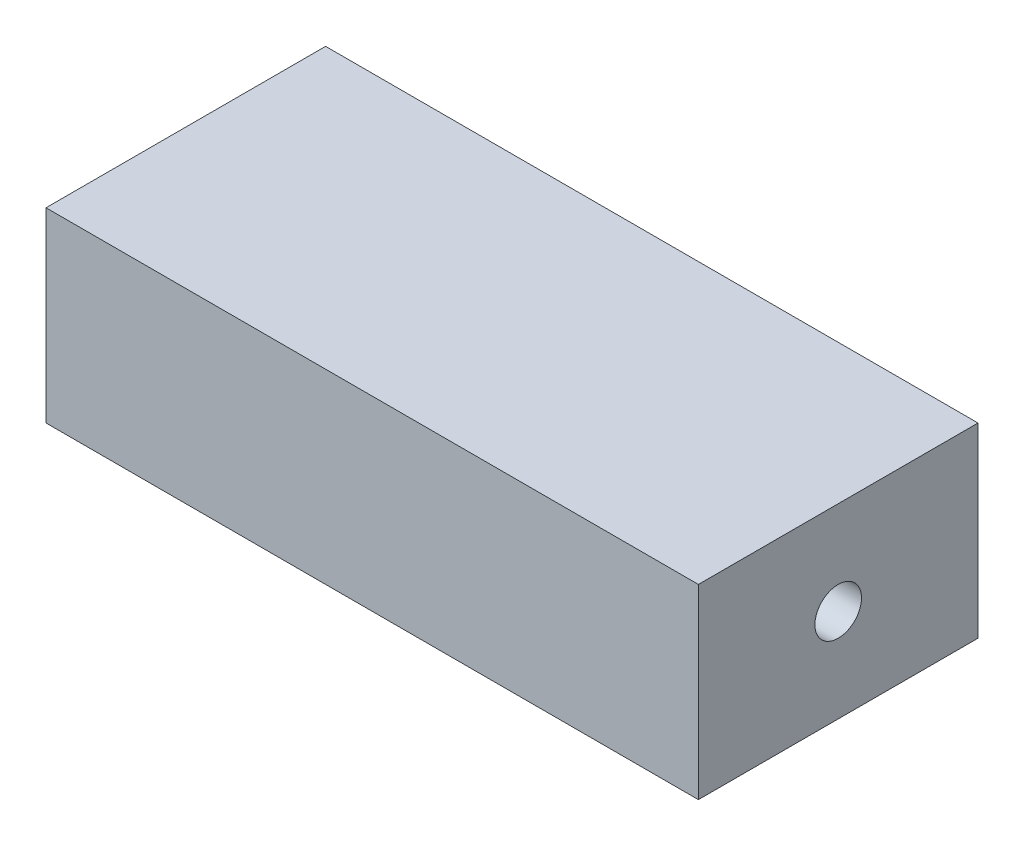
ISO-10303-21;
HEADER;
FILE_DESCRIPTION(('STEP AP214'),'2;1');
FILE_NAME('part.step','',(''),(''),'','','');
FILE_SCHEMA(('AUTOMOTIVE_DESIGN { 1 0 10303 214 1 1 1 1 }'));
ENDSEC;
DATA;
#1=APPLICATION_CONTEXT('core data for automotive mechanical design processes');
#2=APPLICATION_PROTOCOL_DEFINITION('international standard','automotive_design',2000,#1);
#3=PRODUCT_CONTEXT('',#1,'mechanical');
#4=PRODUCT('Part','Part','',(#3));
#5=PRODUCT_RELATED_PRODUCT_CATEGORY('part','',(#4));
#6=PRODUCT_DEFINITION_FORMATION('','',#4);
#7=PRODUCT_DEFINITION_CONTEXT('part definition',#1,'design');
#8=PRODUCT_DEFINITION('design','',#6,#7);
#9=PRODUCT_DEFINITION_SHAPE('','',#8);
#10=(LENGTH_UNIT() NAMED_UNIT(*) SI_UNIT(.MILLI.,.METRE.));
#11=(NAMED_UNIT(*) PLANE_ANGLE_UNIT() SI_UNIT($,.RADIAN.));
#12=(NAMED_UNIT(*) SI_UNIT($,.STERADIAN.) SOLID_ANGLE_UNIT());
#13=UNCERTAINTY_MEASURE_WITH_UNIT(LENGTH_MEASURE(1.E-05),#10,'distance_accuracy_value','');
#14=(GEOMETRIC_REPRESENTATION_CONTEXT(3) GLOBAL_UNCERTAINTY_ASSIGNED_CONTEXT((#13)) GLOBAL_UNIT_ASSIGNED_CONTEXT((#10,
#11,#12)) REPRESENTATION_CONTEXT('',''));
#15=CARTESIAN_POINT('',(0.,0.,0.));
#16=DIRECTION('',(0.,0.,1.));
#17=DIRECTION('',(1.,0.,0.));
#18=AXIS2_PLACEMENT_3D('',#15,#16,#17);
#19=CARTESIAN_POINT('',(0.,25.4,0.));
#20=DIRECTION('',(1.,0.,0.));
#21=DIRECTION('',(0.,0.,-1.));
#22=AXIS2_PLACEMENT_3D('',#19,#20,#21);
#23=PLANE('',#22);
#24=CARTESIAN_POINT('',(0.,12.7,-19.05));
#25=DIRECTION('',(1.,0.,0.));
#26=DIRECTION('',(0.,0.,-1.));
#27=AXIS2_PLACEMENT_3D('',#24,#25,#26);
#28=CIRCLE('',#27,3.175);
#29=CARTESIAN_POINT('',(0.,12.7,-22.225));
#30=VERTEX_POINT('',#29);
#31=EDGE_CURVE('E110',#30,#30,#28,.T.);
#32=ORIENTED_EDGE('',*,*,#31,.T.);
#33=EDGE_LOOP('',(#32));
#34=FACE_BOUND('',#33,.T.);
#35=DIRECTION('',(0.,0.,1.));
#36=VECTOR('',#35,1.);
#37=CARTESIAN_POINT('',(0.,0.,0.));
#38=LINE('',#37,#36);
#39=CARTESIAN_POINT('',(0.,0.,-38.1));
#40=VERTEX_POINT('',#39);
#41=CARTESIAN_POINT('',(0.,0.,0.));
#42=VERTEX_POINT('',#41);
#43=EDGE_CURVE('E106',#40,#42,#38,.T.);
#44=ORIENTED_EDGE('',*,*,#43,.T.);
#45=DIRECTION('',(0.,-1.,0.));
#46=VECTOR('',#45,1.);
#47=CARTESIAN_POINT('',(0.,25.4,0.));
#48=LINE('',#47,#46);
#49=CARTESIAN_POINT('',(0.,25.4,0.));
#50=VERTEX_POINT('',#49);
#51=EDGE_CURVE('E11',#50,#42,#48,.T.);
#52=ORIENTED_EDGE('',*,*,#51,.F.);
#53=DIRECTION('',(0.,0.,1.));
#54=VECTOR('',#53,1.);
#55=CARTESIAN_POINT('',(0.,25.4,0.));
#56=LINE('',#55,#54);
#57=CARTESIAN_POINT('',(0.,25.4,-38.1));
#58=VERTEX_POINT('',#57);
#59=EDGE_CURVE('E90',#58,#50,#56,.T.);
#60=ORIENTED_EDGE('',*,*,#59,.F.);
#61=DIRECTION('',(0.,-1.,0.));
#62=VECTOR('',#61,1.);
#63=CARTESIAN_POINT('',(0.,25.4,-38.1));
#64=LINE('',#63,#62);
#65=EDGE_CURVE('E102',#58,#40,#64,.T.);
#66=ORIENTED_EDGE('',*,*,#65,.T.);
#67=EDGE_LOOP('',(#44,#52,#60,#66));
#68=FACE_BOUND('',#67,.T.);
#69=ADVANCED_FACE('F38',(#34,#68),#23,.F.);
#70=CARTESIAN_POINT('',(0.,25.4,0.));
#71=DIRECTION('',(0.,0.,-1.));
#72=DIRECTION('',(-1.,0.,0.));
#73=AXIS2_PLACEMENT_3D('',#70,#71,#72);
#74=PLANE('',#73);
#75=DIRECTION('',(1.,0.,0.));
#76=VECTOR('',#75,1.);
#77=CARTESIAN_POINT('',(0.,0.,0.));
#78=LINE('',#77,#76);
#79=CARTESIAN_POINT('',(88.9,0.,0.));
#80=VERTEX_POINT('',#79);
#81=EDGE_CURVE('E95',#42,#80,#78,.T.);
#82=ORIENTED_EDGE('',*,*,#81,.T.);
#83=DIRECTION('',(0.,-1.,0.));
#84=VECTOR('',#83,1.);
#85=CARTESIAN_POINT('',(88.9,25.4,0.));
#86=LINE('',#85,#84);
#87=CARTESIAN_POINT('',(88.9,25.4,0.));
#88=VERTEX_POINT('',#87);
#89=EDGE_CURVE('E47',#88,#80,#86,.T.);
#90=ORIENTED_EDGE('',*,*,#89,.F.);
#91=DIRECTION('',(1.,0.,0.));
#92=VECTOR('',#91,1.);
#93=CARTESIAN_POINT('',(0.,25.4,0.));
#94=LINE('',#93,#92);
#95=EDGE_CURVE('E85',#50,#88,#94,.T.);
#96=ORIENTED_EDGE('',*,*,#95,.F.);
#97=ORIENTED_EDGE('',*,*,#51,.T.);
#98=EDGE_LOOP('',(#82,#90,#96,#97));
#99=FACE_BOUND('',#98,.T.);
#100=ADVANCED_FACE('F94',(#99),#74,.F.);
#101=CARTESIAN_POINT('',(88.9,25.4,0.));
#102=DIRECTION('',(-1.,0.,0.));
#103=DIRECTION('',(0.,0.,1.));
#104=AXIS2_PLACEMENT_3D('',#101,#102,#103);
#105=PLANE('',#104);
#106=CARTESIAN_POINT('',(88.9,12.7,-19.05));
#107=DIRECTION('',(1.,0.,0.));
#108=DIRECTION('',(0.,0.,-1.));
#109=AXIS2_PLACEMENT_3D('',#106,#107,#108);
#110=CIRCLE('',#109,3.175);
#111=CARTESIAN_POINT('',(88.9,12.7,-22.225));
#112=VERTEX_POINT('',#111);
#113=EDGE_CURVE('E127',#112,#112,#110,.T.);
#114=ORIENTED_EDGE('',*,*,#113,.F.);
#115=EDGE_LOOP('',(#114));
#116=FACE_BOUND('',#115,.T.);
#117=DIRECTION('',(0.,0.,-1.));
#118=VECTOR('',#117,1.);
#119=CARTESIAN_POINT('',(88.9,0.,0.));
#120=LINE('',#119,#118);
#121=CARTESIAN_POINT('',(88.9,0.,-38.1));
#122=VERTEX_POINT('',#121);
#123=EDGE_CURVE('E72',#80,#122,#120,.T.);
#124=ORIENTED_EDGE('',*,*,#123,.T.);
#125=DIRECTION('',(0.,-1.,0.));
#126=VECTOR('',#125,1.);
#127=CARTESIAN_POINT('',(88.9,25.4,-38.1));
#128=LINE('',#127,#126);
#129=CARTESIAN_POINT('',(88.9,25.4,-38.1));
#130=VERTEX_POINT('',#129);
#131=EDGE_CURVE('E97',#130,#122,#128,.T.);
#132=ORIENTED_EDGE('',*,*,#131,.F.);
#133=DIRECTION('',(0.,0.,-1.));
#134=VECTOR('',#133,1.);
#135=CARTESIAN_POINT('',(88.9,25.4,0.));
#136=LINE('',#135,#134);
#137=EDGE_CURVE('E88',#88,#130,#136,.T.);
#138=ORIENTED_EDGE('',*,*,#137,.F.);
#139=ORIENTED_EDGE('',*,*,#89,.T.);
#140=EDGE_LOOP('',(#124,#132,#138,#139));
#141=FACE_BOUND('',#140,.T.);
#142=ADVANCED_FACE('F98',(#116,#141),#105,.F.);
#143=CARTESIAN_POINT('',(0.,25.4,-38.1));
#144=DIRECTION('',(0.,0.,1.));
#145=DIRECTION('',(1.,0.,0.));
#146=AXIS2_PLACEMENT_3D('',#143,#144,#145);
#147=PLANE('',#146);
#148=DIRECTION('',(-1.,0.,0.));
#149=VECTOR('',#148,1.);
#150=CARTESIAN_POINT('',(0.,0.,-38.1));
#151=LINE('',#150,#149);
#152=EDGE_CURVE('E78',#122,#40,#151,.T.);
#153=ORIENTED_EDGE('',*,*,#152,.T.);
#154=ORIENTED_EDGE('',*,*,#65,.F.);
#155=DIRECTION('',(-1.,0.,0.));
#156=VECTOR('',#155,1.);
#157=CARTESIAN_POINT('',(0.,25.4,-38.1));
#158=LINE('',#157,#156);
#159=EDGE_CURVE('E55',#130,#58,#158,.T.);
#160=ORIENTED_EDGE('',*,*,#159,.F.);
#161=ORIENTED_EDGE('',*,*,#131,.T.);
#162=EDGE_LOOP('',(#153,#154,#160,#161));
#163=FACE_BOUND('',#162,.T.);
#164=ADVANCED_FACE('F120',(#163),#147,.F.);
#165=CARTESIAN_POINT('',(0.,25.4,0.));
#166=DIRECTION('',(0.,-1.,0.));
#167=DIRECTION('',(0.,0.,-1.));
#168=AXIS2_PLACEMENT_3D('',#165,#166,#167);
#169=PLANE('',#168);
#170=ORIENTED_EDGE('',*,*,#59,.T.);
#171=ORIENTED_EDGE('',*,*,#95,.T.);
#172=ORIENTED_EDGE('',*,*,#137,.T.);
#173=ORIENTED_EDGE('',*,*,#159,.T.);
#174=EDGE_LOOP('',(#170,#171,#172,#173));
#175=FACE_BOUND('',#174,.T.);
#176=ADVANCED_FACE('F86',(#175),#169,.F.);
#177=CARTESIAN_POINT('',(0.,0.,0.));
#178=DIRECTION('',(0.,-1.,0.));
#179=DIRECTION('',(0.,0.,-1.));
#180=AXIS2_PLACEMENT_3D('',#177,#178,#179);
#181=PLANE('',#180);
#182=ORIENTED_EDGE('',*,*,#43,.F.);
#183=ORIENTED_EDGE('',*,*,#152,.F.);
#184=ORIENTED_EDGE('',*,*,#123,.F.);
#185=ORIENTED_EDGE('',*,*,#81,.F.);
#186=EDGE_LOOP('',(#182,#183,#184,#185));
#187=FACE_BOUND('',#186,.T.);
#188=ADVANCED_FACE('F123',(#187),#181,.T.);
#189=CARTESIAN_POINT('',(0.,12.7,-19.05));
#190=DIRECTION('',(1.,0.,0.));
#191=DIRECTION('',(0.,0.,-1.));
#192=AXIS2_PLACEMENT_3D('',#189,#190,#191);
#193=CYLINDRICAL_SURFACE('',#192,3.175);
#194=ORIENTED_EDGE('',*,*,#31,.F.);
#195=EDGE_LOOP('',(#194));
#196=FACE_BOUND('',#195,.T.);
#197=ORIENTED_EDGE('',*,*,#113,.T.);
#198=EDGE_LOOP('',(#197));
#199=FACE_BOUND('',#198,.T.);
#200=ADVANCED_FACE('F136',(#196,#199),#193,.F.);
#201=CLOSED_SHELL('',(#69,#100,#142,#164,#176,#188,#200));
#202=MANIFOLD_SOLID_BREP('B2',#201);
#203=ADVANCED_BREP_SHAPE_REPRESENTATION('',(#18,#202),#14);
#204=SHAPE_DEFINITION_REPRESENTATION(#9,#203);
ENDSEC;
END-ISO-10303-21;
